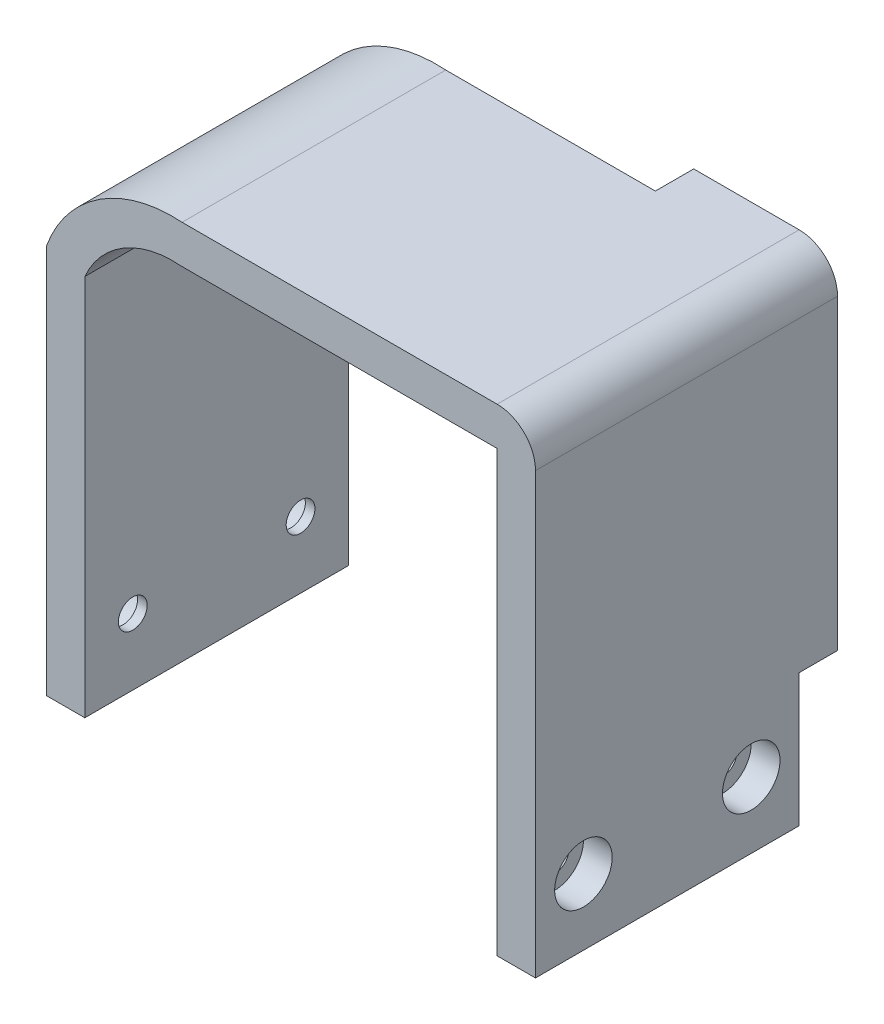
ISO-10303-21;
HEADER;
FILE_DESCRIPTION(('STEP AP214'),'2;1');
FILE_NAME('part.step','',(''),(''),'','','');
FILE_SCHEMA(('AUTOMOTIVE_DESIGN { 1 0 10303 214 1 1 1 1 }'));
ENDSEC;
DATA;
#1=APPLICATION_CONTEXT('core data for automotive mechanical design processes');
#2=APPLICATION_PROTOCOL_DEFINITION('international standard','automotive_design',2000,#1);
#3=PRODUCT_CONTEXT('',#1,'mechanical');
#4=PRODUCT('Part','Part','',(#3));
#5=PRODUCT_RELATED_PRODUCT_CATEGORY('part','',(#4));
#6=PRODUCT_DEFINITION_FORMATION('','',#4);
#7=PRODUCT_DEFINITION_CONTEXT('part definition',#1,'design');
#8=PRODUCT_DEFINITION('design','',#6,#7);
#9=PRODUCT_DEFINITION_SHAPE('','',#8);
#10=(LENGTH_UNIT() NAMED_UNIT(*) SI_UNIT(.MILLI.,.METRE.));
#11=(NAMED_UNIT(*) PLANE_ANGLE_UNIT() SI_UNIT($,.RADIAN.));
#12=(NAMED_UNIT(*) SI_UNIT($,.STERADIAN.) SOLID_ANGLE_UNIT());
#13=UNCERTAINTY_MEASURE_WITH_UNIT(LENGTH_MEASURE(1.E-05),#10,'distance_accuracy_value','');
#14=(GEOMETRIC_REPRESENTATION_CONTEXT(3) GLOBAL_UNCERTAINTY_ASSIGNED_CONTEXT((#13)) GLOBAL_UNIT_ASSIGNED_CONTEXT((#10,
#11,#12)) REPRESENTATION_CONTEXT('',''));
#15=CARTESIAN_POINT('',(0.,0.,0.));
#16=DIRECTION('',(0.,0.,1.));
#17=DIRECTION('',(1.,0.,0.));
#18=AXIS2_PLACEMENT_3D('',#15,#16,#17);
#19=CARTESIAN_POINT('',(-31.2635652675622,-0.826290167174651,27.5));
#20=DIRECTION('',(1.,0.,0.));
#21=DIRECTION('',(0.,0.,-1.));
#22=AXIS2_PLACEMENT_3D('',#19,#20,#21);
#23=PLANE('',#22);
#24=CARTESIAN_POINT('',(-31.2635652675622,6.08685491641266,5.));
#25=DIRECTION('',(1.,0.,0.));
#26=DIRECTION('',(0.,0.,-1.));
#27=AXIS2_PLACEMENT_3D('',#24,#25,#26);
#28=CIRCLE('',#27,3.);
#29=CARTESIAN_POINT('',(-31.2635652675622,6.08685491641266,2.));
#30=VERTEX_POINT('',#29);
#31=EDGE_CURVE('E325',#30,#30,#28,.T.);
#32=ORIENTED_EDGE('',*,*,#31,.T.);
#33=EDGE_LOOP('',(#32));
#34=FACE_BOUND('',#33,.T.);
#35=DIRECTION('',(0.,-1.,0.));
#36=VECTOR('',#35,1.);
#37=CARTESIAN_POINT('',(-31.2635652675622,-0.826290167174651,0.));
#38=LINE('',#37,#36);
#39=CARTESIAN_POINT('',(-31.2635652675622,39.7939229466665,0.));
#40=VERTEX_POINT('',#39);
#41=CARTESIAN_POINT('',(-31.2635652675622,-0.826290167174651,0.));
#42=VERTEX_POINT('',#41);
#43=EDGE_CURVE('E186',#40,#42,#38,.T.);
#44=ORIENTED_EDGE('',*,*,#43,.T.);
#45=DIRECTION('',(0.,0.,-1.));
#46=VECTOR('',#45,1.);
#47=CARTESIAN_POINT('',(-31.2635652675622,-0.826290167174651,27.5));
#48=LINE('',#47,#46);
#49=CARTESIAN_POINT('',(-31.2635652675622,-0.826290167174651,27.5));
#50=VERTEX_POINT('',#49);
#51=EDGE_CURVE('E203',#50,#42,#48,.T.);
#52=ORIENTED_EDGE('',*,*,#51,.F.);
#53=DIRECTION('',(0.,-1.,0.));
#54=VECTOR('',#53,1.);
#55=CARTESIAN_POINT('',(-31.2635652675622,-0.826290167174651,27.5));
#56=LINE('',#55,#54);
#57=CARTESIAN_POINT('',(-31.2635652675622,39.7939229466665,27.5));
#58=VERTEX_POINT('',#57);
#59=EDGE_CURVE('E202',#58,#50,#56,.T.);
#60=ORIENTED_EDGE('',*,*,#59,.F.);
#61=DIRECTION('',(0.,0.,-1.));
#62=VECTOR('',#61,1.);
#63=CARTESIAN_POINT('',(-31.2635652675622,39.7939229466665,27.5));
#64=LINE('',#63,#62);
#65=EDGE_CURVE('E225',#58,#40,#64,.T.);
#66=ORIENTED_EDGE('',*,*,#65,.T.);
#67=EDGE_LOOP('',(#44,#52,#60,#66));
#68=FACE_BOUND('',#67,.T.);
#69=CARTESIAN_POINT('',(-31.2635652675622,6.08685491641266,22.5));
#70=DIRECTION('',(1.,0.,0.));
#71=DIRECTION('',(0.,0.,-1.));
#72=AXIS2_PLACEMENT_3D('',#69,#70,#71);
#73=CIRCLE('',#72,3.);
#74=CARTESIAN_POINT('',(-31.2635652675622,6.08685491641266,19.5));
#75=VERTEX_POINT('',#74);
#76=EDGE_CURVE('E335',#75,#75,#73,.T.);
#77=ORIENTED_EDGE('',*,*,#76,.T.);
#78=EDGE_LOOP('',(#77));
#79=FACE_BOUND('',#78,.T.);
#80=ADVANCED_FACE('F47',(#34,#68,#79),#23,.F.);
#81=CARTESIAN_POINT('',(-31.2635652675622,6.08685491641266,5.));
#82=DIRECTION('',(1.,0.,0.));
#83=DIRECTION('',(0.,0.,-1.));
#84=AXIS2_PLACEMENT_3D('',#81,#82,#83);
#85=CYLINDRICAL_SURFACE('',#84,1.5);
#86=CARTESIAN_POINT('',(-27.2635652675622,6.08685491641266,5.));
#87=DIRECTION('',(-1.,0.,0.));
#88=DIRECTION('',(0.,0.,1.));
#89=AXIS2_PLACEMENT_3D('',#86,#87,#88);
#90=CIRCLE('',#89,1.5);
#91=CARTESIAN_POINT('',(-27.2635652675622,6.08685491641266,6.5));
#92=VERTEX_POINT('',#91);
#93=EDGE_CURVE('E300',#92,#92,#90,.T.);
#94=ORIENTED_EDGE('',*,*,#93,.F.);
#95=EDGE_LOOP('',(#94));
#96=FACE_BOUND('',#95,.T.);
#97=CARTESIAN_POINT('',(-28.2635652675622,6.08685491641266,5.));
#98=DIRECTION('',(1.,0.,0.));
#99=DIRECTION('',(0.,0.,-1.));
#100=AXIS2_PLACEMENT_3D('',#97,#98,#99);
#101=CIRCLE('',#100,1.5);
#102=CARTESIAN_POINT('',(-28.2635652675622,6.08685491641266,3.5));
#103=VERTEX_POINT('',#102);
#104=EDGE_CURVE('E329',#103,#103,#101,.T.);
#105=ORIENTED_EDGE('',*,*,#104,.F.);
#106=EDGE_LOOP('',(#105));
#107=FACE_BOUND('',#106,.T.);
#108=ADVANCED_FACE('F348',(#96,#107),#85,.F.);
#109=CARTESIAN_POINT('',(-31.2635652675622,6.08685491641266,22.5));
#110=DIRECTION('',(1.,0.,0.));
#111=DIRECTION('',(0.,0.,-1.));
#112=AXIS2_PLACEMENT_3D('',#109,#110,#111);
#113=CYLINDRICAL_SURFACE('',#112,1.5);
#114=CARTESIAN_POINT('',(-27.2635652675622,6.08685491641266,22.5));
#115=DIRECTION('',(-1.,0.,0.));
#116=DIRECTION('',(0.,0.,1.));
#117=AXIS2_PLACEMENT_3D('',#114,#115,#116);
#118=CIRCLE('',#117,1.5);
#119=CARTESIAN_POINT('',(-27.2635652675622,6.08685491641266,24.));
#120=VERTEX_POINT('',#119);
#121=EDGE_CURVE('E287',#120,#120,#118,.T.);
#122=ORIENTED_EDGE('',*,*,#121,.F.);
#123=EDGE_LOOP('',(#122));
#124=FACE_BOUND('',#123,.T.);
#125=CARTESIAN_POINT('',(-28.2635652675622,6.08685491641266,22.5));
#126=DIRECTION('',(1.,0.,0.));
#127=DIRECTION('',(0.,0.,-1.));
#128=AXIS2_PLACEMENT_3D('',#125,#126,#127);
#129=CIRCLE('',#128,1.5);
#130=CARTESIAN_POINT('',(-28.2635652675622,6.08685491641266,21.));
#131=VERTEX_POINT('',#130);
#132=EDGE_CURVE('E332',#131,#131,#129,.T.);
#133=ORIENTED_EDGE('',*,*,#132,.F.);
#134=EDGE_LOOP('',(#133));
#135=FACE_BOUND('',#134,.T.);
#136=ADVANCED_FACE('F345',(#124,#135),#113,.F.);
#137=CARTESIAN_POINT('',(15.7364347324378,6.08685491641266,5.));
#138=DIRECTION('',(1.,0.,0.));
#139=DIRECTION('',(0.,1.,0.));
#140=AXIS2_PLACEMENT_3D('',#137,#138,#139);
#141=CIRCLE('',#140,1.5);
#142=CARTESIAN_POINT('',(15.7364347324378,7.58685491641266,5.));
#143=VERTEX_POINT('',#142);
#144=EDGE_CURVE('E303',#143,#143,#141,.T.);
#145=ORIENTED_EDGE('',*,*,#144,.F.);
#146=EDGE_LOOP('',(#145));
#147=FACE_BOUND('',#146,.T.);
#148=CARTESIAN_POINT('',(16.7364347324378,6.08685491641266,5.));
#149=DIRECTION('',(1.,0.,0.));
#150=DIRECTION('',(0.,0.,-1.));
#151=AXIS2_PLACEMENT_3D('',#148,#149,#150);
#152=CIRCLE('',#151,1.5);
#153=CARTESIAN_POINT('',(16.7364347324378,6.08685491641266,3.5));
#154=VERTEX_POINT('',#153);
#155=EDGE_CURVE('E311',#154,#154,#152,.T.);
#156=ORIENTED_EDGE('',*,*,#155,.T.);
#157=EDGE_LOOP('',(#156));
#158=FACE_BOUND('',#157,.T.);
#159=ADVANCED_FACE('F347',(#147,#158),#85,.F.);
#160=CARTESIAN_POINT('',(15.7364347324378,6.08685491641266,22.5));
#161=DIRECTION('',(1.,0.,0.));
#162=DIRECTION('',(0.,1.,0.));
#163=AXIS2_PLACEMENT_3D('',#160,#161,#162);
#164=CIRCLE('',#163,1.5);
#165=CARTESIAN_POINT('',(15.7364347324378,7.58685491641266,22.5));
#166=VERTEX_POINT('',#165);
#167=EDGE_CURVE('E297',#166,#166,#164,.T.);
#168=ORIENTED_EDGE('',*,*,#167,.F.);
#169=EDGE_LOOP('',(#168));
#170=FACE_BOUND('',#169,.T.);
#171=CARTESIAN_POINT('',(16.7364347324378,6.08685491641266,22.5));
#172=DIRECTION('',(1.,0.,0.));
#173=DIRECTION('',(0.,0.,-1.));
#174=AXIS2_PLACEMENT_3D('',#171,#172,#173);
#175=CIRCLE('',#174,1.5);
#176=CARTESIAN_POINT('',(16.7364347324378,6.08685491641266,21.));
#177=VERTEX_POINT('',#176);
#178=EDGE_CURVE('E314',#177,#177,#175,.T.);
#179=ORIENTED_EDGE('',*,*,#178,.T.);
#180=EDGE_LOOP('',(#179));
#181=FACE_BOUND('',#180,.T.);
#182=ADVANCED_FACE('F351',(#170,#181),#113,.F.);
#183=CARTESIAN_POINT('',(12.7364347324378,15.5,-4.));
#184=DIRECTION('',(0.,0.,1.));
#185=DIRECTION('',(1.,0.,0.));
#186=AXIS2_PLACEMENT_3D('',#183,#184,#185);
#187=CYLINDRICAL_SURFACE('',#186,1.25);
#188=CARTESIAN_POINT('',(12.7364347324378,15.5,0.));
#189=DIRECTION('',(0.,0.,1.));
#190=DIRECTION('',(1.,0.,0.));
#191=AXIS2_PLACEMENT_3D('',#188,#189,#190);
#192=CIRCLE('',#191,1.25);
#193=CARTESIAN_POINT('',(13.9864347324378,15.5,0.));
#194=VERTEX_POINT('',#193);
#195=EDGE_CURVE('E271',#194,#194,#192,.T.);
#196=ORIENTED_EDGE('',*,*,#195,.T.);
#197=EDGE_LOOP('',(#196));
#198=FACE_BOUND('',#197,.T.);
#199=CARTESIAN_POINT('',(12.7364347324378,15.5,-2.));
#200=DIRECTION('',(0.,0.,-1.));
#201=DIRECTION('',(-1.,0.,0.));
#202=AXIS2_PLACEMENT_3D('',#199,#200,#201);
#203=CIRCLE('',#202,1.25);
#204=CARTESIAN_POINT('',(11.4864347324378,15.5,-2.));
#205=VERTEX_POINT('',#204);
#206=EDGE_CURVE('E281',#205,#205,#203,.T.);
#207=ORIENTED_EDGE('',*,*,#206,.T.);
#208=EDGE_LOOP('',(#207));
#209=FACE_BOUND('',#208,.T.);
#210=ADVANCED_FACE('F362',(#198,#209),#187,.F.);
#211=CARTESIAN_POINT('',(12.7364347324378,42.5,-4.));
#212=DIRECTION('',(0.,0.,1.));
#213=DIRECTION('',(1.,0.,0.));
#214=AXIS2_PLACEMENT_3D('',#211,#212,#213);
#215=CYLINDRICAL_SURFACE('',#214,1.25);
#216=CARTESIAN_POINT('',(12.7364347324378,42.5,0.));
#217=DIRECTION('',(0.,0.,1.));
#218=DIRECTION('',(1.,0.,0.));
#219=AXIS2_PLACEMENT_3D('',#216,#217,#218);
#220=CIRCLE('',#219,1.25);
#221=CARTESIAN_POINT('',(13.9864347324378,42.5,0.));
#222=VERTEX_POINT('',#221);
#223=EDGE_CURVE('E266',#222,#222,#220,.T.);
#224=ORIENTED_EDGE('',*,*,#223,.T.);
#225=EDGE_LOOP('',(#224));
#226=FACE_BOUND('',#225,.T.);
#227=CARTESIAN_POINT('',(12.7364347324378,42.5,-2.));
#228=DIRECTION('',(0.,0.,-1.));
#229=DIRECTION('',(-1.,0.,0.));
#230=AXIS2_PLACEMENT_3D('',#227,#228,#229);
#231=CIRCLE('',#230,1.25);
#232=CARTESIAN_POINT('',(11.4864347324378,42.5,-2.));
#233=VERTEX_POINT('',#232);
#234=EDGE_CURVE('E284',#233,#233,#231,.T.);
#235=ORIENTED_EDGE('',*,*,#234,.T.);
#236=EDGE_LOOP('',(#235));
#237=FACE_BOUND('',#236,.T.);
#238=ADVANCED_FACE('F411',(#226,#237),#215,.F.);
#239=CARTESIAN_POINT('',(-18.0975943147421,35.0339640319806,0.));
#240=DIRECTION('',(0.,0.,-1.));
#241=DIRECTION('',(-1.,0.,0.));
#242=AXIS2_PLACEMENT_3D('',#239,#240,#241);
#243=PLANE('',#242);
#244=DIRECTION('',(0.,1.,0.));
#245=VECTOR('',#244,1.);
#246=CARTESIAN_POINT('',(4.73643473243776,49.,0.));
#247=LINE('',#246,#245);
#248=CARTESIAN_POINT('',(4.73643473243775,45.,0.));
#249=VERTEX_POINT('',#248);
#250=CARTESIAN_POINT('',(4.73643473243775,49.,0.));
#251=VERTEX_POINT('',#250);
#252=EDGE_CURVE('E248',#249,#251,#247,.T.);
#253=ORIENTED_EDGE('',*,*,#252,.F.);
#254=DIRECTION('',(1.,0.,0.));
#255=VECTOR('',#254,1.);
#256=CARTESIAN_POINT('',(-17.2741095946992,45.,0.));
#257=LINE('',#256,#255);
#258=CARTESIAN_POINT('',(-17.2741095946992,45.,0.));
#259=VERTEX_POINT('',#258);
#260=EDGE_CURVE('E209',#259,#249,#257,.T.);
#261=ORIENTED_EDGE('',*,*,#260,.F.);
#262=CARTESIAN_POINT('',(-18.0975943147421,35.0339640319806,0.));
#263=DIRECTION('',(0.,0.,-1.));
#264=DIRECTION('',(-1.,0.,0.));
#265=AXIS2_PLACEMENT_3D('',#262,#263,#264);
#266=CIRCLE('',#265,10.);
#267=CARTESIAN_POINT('',(-27.2635652675622,39.0320856524492,0.));
#268=VERTEX_POINT('',#267);
#269=EDGE_CURVE('E206',#268,#259,#266,.T.);
#270=ORIENTED_EDGE('',*,*,#269,.F.);
#271=DIRECTION('',(0.,1.,0.));
#272=VECTOR('',#271,1.);
#273=CARTESIAN_POINT('',(-27.2635652675622,-0.826290167174651,0.));
#274=LINE('',#273,#272);
#275=CARTESIAN_POINT('',(-27.2635652675622,-0.826290167174651,0.));
#276=VERTEX_POINT('',#275);
#277=EDGE_CURVE('E176',#276,#268,#274,.T.);
#278=ORIENTED_EDGE('',*,*,#277,.F.);
#279=DIRECTION('',(1.,0.,0.));
#280=VECTOR('',#279,1.);
#281=CARTESIAN_POINT('',(-27.2635652675622,-0.826290167174651,0.));
#282=LINE('',#281,#280);
#283=EDGE_CURVE('E173',#42,#276,#282,.T.);
#284=ORIENTED_EDGE('',*,*,#283,.F.);
#285=ORIENTED_EDGE('',*,*,#43,.F.);
#286=CARTESIAN_POINT('',(-18.0975943147421,35.0339640319806,0.));
#287=DIRECTION('',(0.,0.,1.));
#288=DIRECTION('',(-1.,0.,0.));
#289=AXIS2_PLACEMENT_3D('',#286,#287,#288);
#290=CIRCLE('',#289,14.);
#291=CARTESIAN_POINT('',(-17.1229973005926,49.,0.));
#292=VERTEX_POINT('',#291);
#293=EDGE_CURVE('E220',#292,#40,#290,.T.);
#294=ORIENTED_EDGE('',*,*,#293,.F.);
#295=DIRECTION('',(-1.,0.,0.));
#296=VECTOR('',#295,1.);
#297=CARTESIAN_POINT('',(-17.1229973005926,49.,0.));
#298=LINE('',#297,#296);
#299=EDGE_CURVE('E218',#251,#292,#298,.T.);
#300=ORIENTED_EDGE('',*,*,#299,.F.);
#301=EDGE_LOOP('',(#253,#261,#270,#278,#284,#285,#294,#300));
#302=FACE_BOUND('',#301,.T.);
#303=ADVANCED_FACE('F406',(#302),#243,.T.);
#304=CARTESIAN_POINT('',(-27.2635652675622,-0.826290167174651,27.5));
#305=DIRECTION('',(0.,1.,0.));
#306=DIRECTION('',(0.,0.,1.));
#307=AXIS2_PLACEMENT_3D('',#304,#305,#306);
#308=PLANE('',#307);
#309=ORIENTED_EDGE('',*,*,#283,.T.);
#310=DIRECTION('',(0.,0.,-1.));
#311=VECTOR('',#310,1.);
#312=CARTESIAN_POINT('',(-27.2635652675622,-0.826290167174651,27.5));
#313=LINE('',#312,#311);
#314=CARTESIAN_POINT('',(-27.2635652675622,-0.826290167174651,27.5));
#315=VERTEX_POINT('',#314);
#316=EDGE_CURVE('E245',#315,#276,#313,.T.);
#317=ORIENTED_EDGE('',*,*,#316,.F.);
#318=DIRECTION('',(1.,0.,0.));
#319=VECTOR('',#318,1.);
#320=CARTESIAN_POINT('',(-27.2635652675622,-0.826290167174651,27.5));
#321=LINE('',#320,#319);
#322=EDGE_CURVE('E182',#50,#315,#321,.T.);
#323=ORIENTED_EDGE('',*,*,#322,.F.);
#324=ORIENTED_EDGE('',*,*,#51,.T.);
#325=EDGE_LOOP('',(#309,#317,#323,#324));
#326=FACE_BOUND('',#325,.T.);
#327=ADVANCED_FACE('F403',(#326),#308,.F.);
#328=CARTESIAN_POINT('',(-27.2635652675622,-0.826290167174651,27.5));
#329=DIRECTION('',(-1.,0.,0.));
#330=DIRECTION('',(0.,0.,1.));
#331=AXIS2_PLACEMENT_3D('',#328,#329,#330);
#332=PLANE('',#331);
#333=ORIENTED_EDGE('',*,*,#121,.T.);
#334=EDGE_LOOP('',(#333));
#335=FACE_BOUND('',#334,.T.);
#336=ORIENTED_EDGE('',*,*,#93,.T.);
#337=EDGE_LOOP('',(#336));
#338=FACE_BOUND('',#337,.T.);
#339=ORIENTED_EDGE('',*,*,#277,.T.);
#340=DIRECTION('',(0.,0.,-1.));
#341=VECTOR('',#340,1.);
#342=CARTESIAN_POINT('',(-27.2635652675622,39.0320856524492,27.5));
#343=LINE('',#342,#341);
#344=CARTESIAN_POINT('',(-27.2635652675622,39.0320856524492,27.5));
#345=VERTEX_POINT('',#344);
#346=EDGE_CURVE('E242',#345,#268,#343,.T.);
#347=ORIENTED_EDGE('',*,*,#346,.F.);
#348=DIRECTION('',(0.,1.,0.));
#349=VECTOR('',#348,1.);
#350=CARTESIAN_POINT('',(-27.2635652675622,-0.826290167174651,27.5));
#351=LINE('',#350,#349);
#352=EDGE_CURVE('E185',#315,#345,#351,.T.);
#353=ORIENTED_EDGE('',*,*,#352,.F.);
#354=ORIENTED_EDGE('',*,*,#316,.T.);
#355=EDGE_LOOP('',(#339,#347,#353,#354));
#356=FACE_BOUND('',#355,.T.);
#357=ADVANCED_FACE('F400',(#335,#338,#356),#332,.F.);
#358=CARTESIAN_POINT('',(-18.0975943147421,35.0339640319806,27.5));
#359=DIRECTION('',(0.,0.,-1.));
#360=DIRECTION('',(-1.,0.,0.));
#361=AXIS2_PLACEMENT_3D('',#358,#359,#360);
#362=CYLINDRICAL_SURFACE('',#361,10.);
#363=ORIENTED_EDGE('',*,*,#269,.T.);
#364=DIRECTION('',(0.,0.,-1.));
#365=VECTOR('',#364,1.);
#366=CARTESIAN_POINT('',(-17.2741095946992,45.,27.5));
#367=LINE('',#366,#365);
#368=CARTESIAN_POINT('',(-17.2741095946992,45.,27.5));
#369=VERTEX_POINT('',#368);
#370=EDGE_CURVE('E239',#369,#259,#367,.T.);
#371=ORIENTED_EDGE('',*,*,#370,.F.);
#372=CARTESIAN_POINT('',(-18.0975943147421,35.0339640319806,27.5));
#373=DIRECTION('',(0.,0.,-1.));
#374=DIRECTION('',(-1.,0.,0.));
#375=AXIS2_PLACEMENT_3D('',#372,#373,#374);
#376=CIRCLE('',#375,10.);
#377=EDGE_CURVE('E188',#345,#369,#376,.T.);
#378=ORIENTED_EDGE('',*,*,#377,.F.);
#379=ORIENTED_EDGE('',*,*,#346,.T.);
#380=EDGE_LOOP('',(#363,#371,#378,#379));
#381=FACE_BOUND('',#380,.T.);
#382=ADVANCED_FACE('F396',(#381),#362,.F.);
#383=CARTESIAN_POINT('',(-17.2741095946992,45.,27.5));
#384=DIRECTION('',(0.,1.,0.));
#385=DIRECTION('',(0.,0.,1.));
#386=AXIS2_PLACEMENT_3D('',#383,#384,#385);
#387=PLANE('',#386);
#388=ORIENTED_EDGE('',*,*,#260,.T.);
#389=CARTESIAN_POINT('',(15.7364347324378,45.,0.));
#390=VERTEX_POINT('',#389);
#391=EDGE_CURVE('E208',#249,#390,#257,.T.);
#392=ORIENTED_EDGE('',*,*,#391,.T.);
#393=DIRECTION('',(0.,0.,-1.));
#394=VECTOR('',#393,1.);
#395=CARTESIAN_POINT('',(15.7364347324378,45.,27.5));
#396=LINE('',#395,#394);
#397=CARTESIAN_POINT('',(15.7364347324378,45.,27.5));
#398=VERTEX_POINT('',#397);
#399=EDGE_CURVE('E236',#398,#390,#396,.T.);
#400=ORIENTED_EDGE('',*,*,#399,.F.);
#401=DIRECTION('',(1.,0.,0.));
#402=VECTOR('',#401,1.);
#403=CARTESIAN_POINT('',(-17.2741095946992,45.,27.5));
#404=LINE('',#403,#402);
#405=EDGE_CURVE('E190',#369,#398,#404,.T.);
#406=ORIENTED_EDGE('',*,*,#405,.F.);
#407=ORIENTED_EDGE('',*,*,#370,.T.);
#408=EDGE_LOOP('',(#388,#392,#400,#406,#407));
#409=FACE_BOUND('',#408,.T.);
#410=ADVANCED_FACE('F392',(#409),#387,.F.);
#411=CARTESIAN_POINT('',(15.7364347324378,45.,27.5));
#412=DIRECTION('',(1.,0.,0.));
#413=DIRECTION('',(0.,1.,0.));
#414=AXIS2_PLACEMENT_3D('',#411,#412,#413);
#415=PLANE('',#414);
#416=ORIENTED_EDGE('',*,*,#167,.T.);
#417=EDGE_LOOP('',(#416));
#418=FACE_BOUND('',#417,.T.);
#419=ORIENTED_EDGE('',*,*,#144,.T.);
#420=EDGE_LOOP('',(#419));
#421=FACE_BOUND('',#420,.T.);
#422=DIRECTION('',(0.,-1.,0.));
#423=VECTOR('',#422,1.);
#424=CARTESIAN_POINT('',(15.7364347324378,45.,0.));
#425=LINE('',#424,#423);
#426=CARTESIAN_POINT('',(15.7364347324378,13.,0.));
#427=VERTEX_POINT('',#426);
#428=EDGE_CURVE('E213',#390,#427,#425,.T.);
#429=ORIENTED_EDGE('',*,*,#428,.T.);
#430=CARTESIAN_POINT('',(15.7364347324378,-0.826290167174649,0.));
#431=VERTEX_POINT('',#430);
#432=EDGE_CURVE('E212',#427,#431,#425,.T.);
#433=ORIENTED_EDGE('',*,*,#432,.T.);
#434=DIRECTION('',(0.,0.,-1.));
#435=VECTOR('',#434,1.);
#436=CARTESIAN_POINT('',(15.7364347324378,-0.826290167174649,27.5));
#437=LINE('',#436,#435);
#438=CARTESIAN_POINT('',(15.7364347324378,-0.826290167174649,27.5));
#439=VERTEX_POINT('',#438);
#440=EDGE_CURVE('E233',#439,#431,#437,.T.);
#441=ORIENTED_EDGE('',*,*,#440,.F.);
#442=DIRECTION('',(0.,-1.,0.));
#443=VECTOR('',#442,1.);
#444=CARTESIAN_POINT('',(15.7364347324378,45.,27.5));
#445=LINE('',#444,#443);
#446=EDGE_CURVE('E192',#398,#439,#445,.T.);
#447=ORIENTED_EDGE('',*,*,#446,.F.);
#448=ORIENTED_EDGE('',*,*,#399,.T.);
#449=EDGE_LOOP('',(#429,#433,#441,#447,#448));
#450=FACE_BOUND('',#449,.T.);
#451=ADVANCED_FACE('F388',(#418,#421,#450),#415,.F.);
#452=CARTESIAN_POINT('',(15.7364347324378,-0.826290167174649,27.5));
#453=DIRECTION('',(0.,1.,0.));
#454=DIRECTION('',(-1.,0.,0.));
#455=AXIS2_PLACEMENT_3D('',#452,#453,#454);
#456=PLANE('',#455);
#457=DIRECTION('',(1.,0.,0.));
#458=VECTOR('',#457,1.);
#459=CARTESIAN_POINT('',(15.7364347324378,-0.826290167174649,0.));
#460=LINE('',#459,#458);
#461=CARTESIAN_POINT('',(19.7364347324378,-0.826290167174649,0.));
#462=VERTEX_POINT('',#461);
#463=EDGE_CURVE('E215',#431,#462,#460,.T.);
#464=ORIENTED_EDGE('',*,*,#463,.T.);
#465=DIRECTION('',(0.,0.,-1.));
#466=VECTOR('',#465,1.);
#467=CARTESIAN_POINT('',(19.7364347324378,-0.826290167174649,27.5));
#468=LINE('',#467,#466);
#469=CARTESIAN_POINT('',(19.7364347324378,-0.826290167174649,27.5));
#470=VERTEX_POINT('',#469);
#471=EDGE_CURVE('E231',#470,#462,#468,.T.);
#472=ORIENTED_EDGE('',*,*,#471,.F.);
#473=DIRECTION('',(1.,0.,0.));
#474=VECTOR('',#473,1.);
#475=CARTESIAN_POINT('',(15.7364347324378,-0.826290167174649,27.5));
#476=LINE('',#475,#474);
#477=EDGE_CURVE('E194',#439,#470,#476,.T.);
#478=ORIENTED_EDGE('',*,*,#477,.F.);
#479=ORIENTED_EDGE('',*,*,#440,.T.);
#480=EDGE_LOOP('',(#464,#472,#478,#479));
#481=FACE_BOUND('',#480,.T.);
#482=ADVANCED_FACE('F384',(#481),#456,.F.);
#483=CARTESIAN_POINT('',(19.7364347324378,49.,27.5));
#484=DIRECTION('',(-1.,0.,0.));
#485=DIRECTION('',(0.,-1.,0.));
#486=AXIS2_PLACEMENT_3D('',#483,#484,#485);
#487=PLANE('',#486);
#488=CARTESIAN_POINT('',(19.7364347324378,6.08685491641266,22.5));
#489=DIRECTION('',(1.,0.,0.));
#490=DIRECTION('',(0.,0.,-1.));
#491=AXIS2_PLACEMENT_3D('',#488,#489,#490);
#492=CIRCLE('',#491,3.);
#493=CARTESIAN_POINT('',(19.7364347324378,6.08685491641266,19.5));
#494=VERTEX_POINT('',#493);
#495=EDGE_CURVE('E318',#494,#494,#492,.T.);
#496=ORIENTED_EDGE('',*,*,#495,.F.);
#497=EDGE_LOOP('',(#496));
#498=FACE_BOUND('',#497,.T.);
#499=CARTESIAN_POINT('',(19.7364347324378,6.08685491641266,5.));
#500=DIRECTION('',(1.,0.,0.));
#501=DIRECTION('',(0.,0.,-1.));
#502=AXIS2_PLACEMENT_3D('',#499,#500,#501);
#503=CIRCLE('',#502,3.);
#504=CARTESIAN_POINT('',(19.7364347324378,6.08685491641266,2.));
#505=VERTEX_POINT('',#504);
#506=EDGE_CURVE('E307',#505,#505,#503,.T.);
#507=ORIENTED_EDGE('',*,*,#506,.F.);
#508=EDGE_LOOP('',(#507));
#509=FACE_BOUND('',#508,.T.);
#510=DIRECTION('',(0.,-1.,0.));
#511=VECTOR('',#510,1.);
#512=CARTESIAN_POINT('',(19.7364347324378,49.,-4.));
#513=LINE('',#512,#511);
#514=CARTESIAN_POINT('',(19.7364347324378,45.,-4.));
#515=VERTEX_POINT('',#514);
#516=CARTESIAN_POINT('',(19.7364347324378,13.,-4.));
#517=VERTEX_POINT('',#516);
#518=EDGE_CURVE('E150',#515,#517,#513,.T.);
#519=ORIENTED_EDGE('',*,*,#518,.F.);
#520=DIRECTION('',(0.,0.,-1.));
#521=VECTOR('',#520,1.);
#522=CARTESIAN_POINT('',(19.7364347324378,45.,27.5));
#523=LINE('',#522,#521);
#524=CARTESIAN_POINT('',(19.7364347324378,45.,27.5));
#525=VERTEX_POINT('',#524);
#526=EDGE_CURVE('E55',#515,#525,#523,.F.);
#527=ORIENTED_EDGE('',*,*,#526,.T.);
#528=DIRECTION('',(0.,1.,0.));
#529=VECTOR('',#528,1.);
#530=CARTESIAN_POINT('',(19.7364347324378,49.,27.5));
#531=LINE('',#530,#529);
#532=EDGE_CURVE('E196',#470,#525,#531,.T.);
#533=ORIENTED_EDGE('',*,*,#532,.F.);
#534=ORIENTED_EDGE('',*,*,#471,.T.);
#535=DIRECTION('',(0.,1.,0.));
#536=VECTOR('',#535,1.);
#537=CARTESIAN_POINT('',(19.7364347324378,49.,0.));
#538=LINE('',#537,#536);
#539=CARTESIAN_POINT('',(19.7364347324378,13.,0.));
#540=VERTEX_POINT('',#539);
#541=EDGE_CURVE('E172',#462,#540,#538,.T.);
#542=ORIENTED_EDGE('',*,*,#541,.T.);
#543=DIRECTION('',(0.,0.,1.));
#544=VECTOR('',#543,1.);
#545=CARTESIAN_POINT('',(19.7364347324378,13.,-4.));
#546=LINE('',#545,#544);
#547=EDGE_CURVE('E162',#517,#540,#546,.T.);
#548=ORIENTED_EDGE('',*,*,#547,.F.);
#549=EDGE_LOOP('',(#519,#527,#533,#534,#542,#548));
#550=FACE_BOUND('',#549,.T.);
#551=ADVANCED_FACE('F169',(#498,#509,#550),#487,.F.);
#552=CARTESIAN_POINT('',(-17.1229973005926,49.,27.5));
#553=DIRECTION('',(0.,-1.,0.));
#554=DIRECTION('',(0.,0.,-1.));
#555=AXIS2_PLACEMENT_3D('',#552,#553,#554);
#556=PLANE('',#555);
#557=DIRECTION('',(-1.,0.,0.));
#558=VECTOR('',#557,1.);
#559=CARTESIAN_POINT('',(-17.1229973005926,49.,27.5));
#560=LINE('',#559,#558);
#561=CARTESIAN_POINT('',(15.7364347324378,49.,27.5));
#562=VERTEX_POINT('',#561);
#563=CARTESIAN_POINT('',(-17.1229973005926,49.,27.5));
#564=VERTEX_POINT('',#563);
#565=EDGE_CURVE('E198',#562,#564,#560,.T.);
#566=ORIENTED_EDGE('',*,*,#565,.F.);
#567=DIRECTION('',(0.,0.,-1.));
#568=VECTOR('',#567,1.);
#569=CARTESIAN_POINT('',(15.7364347324378,49.,27.5));
#570=LINE('',#569,#568);
#571=CARTESIAN_POINT('',(15.7364347324378,49.,-4.));
#572=VERTEX_POINT('',#571);
#573=EDGE_CURVE('E249',#562,#572,#570,.T.);
#574=ORIENTED_EDGE('',*,*,#573,.T.);
#575=DIRECTION('',(1.,0.,0.));
#576=VECTOR('',#575,1.);
#577=CARTESIAN_POINT('',(19.7364347324378,49.,-4.));
#578=LINE('',#577,#576);
#579=CARTESIAN_POINT('',(4.73643473243776,49.,-4.));
#580=VERTEX_POINT('',#579);
#581=EDGE_CURVE('E268',#580,#572,#578,.T.);
#582=ORIENTED_EDGE('',*,*,#581,.F.);
#583=DIRECTION('',(0.,0.,1.));
#584=VECTOR('',#583,1.);
#585=CARTESIAN_POINT('',(4.73643473243776,49.,-4.));
#586=LINE('',#585,#584);
#587=EDGE_CURVE('E178',#580,#251,#586,.T.);
#588=ORIENTED_EDGE('',*,*,#587,.T.);
#589=ORIENTED_EDGE('',*,*,#299,.T.);
#590=DIRECTION('',(0.,0.,-1.));
#591=VECTOR('',#590,1.);
#592=CARTESIAN_POINT('',(-17.1229973005926,49.,27.5));
#593=LINE('',#592,#591);
#594=EDGE_CURVE('E228',#564,#292,#593,.T.);
#595=ORIENTED_EDGE('',*,*,#594,.F.);
#596=EDGE_LOOP('',(#566,#574,#582,#588,#589,#595));
#597=FACE_BOUND('',#596,.T.);
#598=ADVANCED_FACE('F378',(#597),#556,.F.);
#599=CARTESIAN_POINT('',(-18.0975943147421,35.0339640319806,27.5));
#600=DIRECTION('',(0.,0.,-1.));
#601=DIRECTION('',(-1.,0.,0.));
#602=AXIS2_PLACEMENT_3D('',#599,#600,#601);
#603=CYLINDRICAL_SURFACE('',#602,14.);
#604=ORIENTED_EDGE('',*,*,#293,.T.);
#605=ORIENTED_EDGE('',*,*,#65,.F.);
#606=CARTESIAN_POINT('',(-18.0975943147421,35.0339640319806,27.5));
#607=DIRECTION('',(0.,0.,1.));
#608=DIRECTION('',(-1.,0.,0.));
#609=AXIS2_PLACEMENT_3D('',#606,#607,#608);
#610=CIRCLE('',#609,14.);
#611=EDGE_CURVE('E200',#564,#58,#610,.T.);
#612=ORIENTED_EDGE('',*,*,#611,.F.);
#613=ORIENTED_EDGE('',*,*,#594,.T.);
#614=EDGE_LOOP('',(#604,#605,#612,#613));
#615=FACE_BOUND('',#614,.T.);
#616=ADVANCED_FACE('F374',(#615),#603,.T.);
#617=CARTESIAN_POINT('',(-18.0975943147421,35.0339640319806,27.5));
#618=DIRECTION('',(0.,0.,-1.));
#619=DIRECTION('',(-1.,0.,0.));
#620=AXIS2_PLACEMENT_3D('',#617,#618,#619);
#621=PLANE('',#620);
#622=ORIENTED_EDGE('',*,*,#532,.T.);
#623=CARTESIAN_POINT('',(15.7364347324378,45.,27.5));
#624=DIRECTION('',(0.,0.,-1.));
#625=DIRECTION('',(-1.,0.,0.));
#626=AXIS2_PLACEMENT_3D('',#623,#624,#625);
#627=CIRCLE('',#626,4.);
#628=EDGE_CURVE('E13',#525,#562,#627,.F.);
#629=ORIENTED_EDGE('',*,*,#628,.T.);
#630=ORIENTED_EDGE('',*,*,#565,.T.);
#631=ORIENTED_EDGE('',*,*,#611,.T.);
#632=ORIENTED_EDGE('',*,*,#59,.T.);
#633=ORIENTED_EDGE('',*,*,#322,.T.);
#634=ORIENTED_EDGE('',*,*,#352,.T.);
#635=ORIENTED_EDGE('',*,*,#377,.T.);
#636=ORIENTED_EDGE('',*,*,#405,.T.);
#637=ORIENTED_EDGE('',*,*,#446,.T.);
#638=ORIENTED_EDGE('',*,*,#477,.T.);
#639=EDGE_LOOP('',(#622,#629,#630,#631,#632,#633,#634,#635,#636,#637,#638));
#640=FACE_BOUND('',#639,.T.);
#641=ADVANCED_FACE('F377',(#640),#621,.F.);
#642=DIRECTION('',(-1.,0.,0.));
#643=VECTOR('',#642,1.);
#644=CARTESIAN_POINT('',(19.7364347324378,13.,0.));
#645=LINE('',#644,#643);
#646=EDGE_CURVE('E263',#540,#427,#645,.T.);
#647=ORIENTED_EDGE('',*,*,#646,.F.);
#648=ORIENTED_EDGE('',*,*,#541,.F.);
#649=ORIENTED_EDGE('',*,*,#463,.F.);
#650=ORIENTED_EDGE('',*,*,#432,.F.);
#651=EDGE_LOOP('',(#647,#648,#649,#650));
#652=FACE_BOUND('',#651,.T.);
#653=ADVANCED_FACE('F372',(#652),#243,.T.);
#654=CARTESIAN_POINT('',(19.7364347324378,13.,-4.));
#655=DIRECTION('',(0.,1.,0.));
#656=DIRECTION('',(0.,0.,1.));
#657=AXIS2_PLACEMENT_3D('',#654,#655,#656);
#658=PLANE('',#657);
#659=ORIENTED_EDGE('',*,*,#646,.T.);
#660=CARTESIAN_POINT('',(4.73643473243775,13.,0.));
#661=VERTEX_POINT('',#660);
#662=EDGE_CURVE('E265',#427,#661,#645,.T.);
#663=ORIENTED_EDGE('',*,*,#662,.T.);
#664=DIRECTION('',(0.,0.,1.));
#665=VECTOR('',#664,1.);
#666=CARTESIAN_POINT('',(4.73643473243775,13.,-4.));
#667=LINE('',#666,#665);
#668=CARTESIAN_POINT('',(4.73643473243775,13.,-4.));
#669=VERTEX_POINT('',#668);
#670=EDGE_CURVE('E164',#669,#661,#667,.T.);
#671=ORIENTED_EDGE('',*,*,#670,.F.);
#672=DIRECTION('',(-1.,0.,0.));
#673=VECTOR('',#672,1.);
#674=CARTESIAN_POINT('',(19.7364347324378,13.,-4.));
#675=LINE('',#674,#673);
#676=EDGE_CURVE('E153',#517,#669,#675,.T.);
#677=ORIENTED_EDGE('',*,*,#676,.F.);
#678=ORIENTED_EDGE('',*,*,#547,.T.);
#679=EDGE_LOOP('',(#659,#663,#671,#677,#678));
#680=FACE_BOUND('',#679,.T.);
#681=ADVANCED_FACE('F161',(#680),#658,.F.);
#682=CARTESIAN_POINT('',(4.73643473243776,49.,-4.));
#683=DIRECTION('',(1.,0.,0.));
#684=DIRECTION('',(0.,1.,0.));
#685=AXIS2_PLACEMENT_3D('',#682,#683,#684);
#686=PLANE('',#685);
#687=EDGE_CURVE('E156',#661,#249,#247,.T.);
#688=ORIENTED_EDGE('',*,*,#687,.T.);
#689=ORIENTED_EDGE('',*,*,#252,.T.);
#690=ORIENTED_EDGE('',*,*,#587,.F.);
#691=DIRECTION('',(0.,1.,0.));
#692=VECTOR('',#691,1.);
#693=CARTESIAN_POINT('',(4.73643473243776,49.,-4.));
#694=LINE('',#693,#692);
#695=EDGE_CURVE('E166',#669,#580,#694,.T.);
#696=ORIENTED_EDGE('',*,*,#695,.F.);
#697=ORIENTED_EDGE('',*,*,#670,.T.);
#698=EDGE_LOOP('',(#688,#689,#690,#696,#697));
#699=FACE_BOUND('',#698,.T.);
#700=ADVANCED_FACE('F430',(#699),#686,.F.);
#701=CARTESIAN_POINT('',(0.,0.,-4.));
#702=DIRECTION('',(0.,0.,-1.));
#703=DIRECTION('',(-1.,0.,0.));
#704=AXIS2_PLACEMENT_3D('',#701,#702,#703);
#705=PLANE('',#704);
#706=CARTESIAN_POINT('',(12.7364347324378,42.5,-4.));
#707=DIRECTION('',(0.,0.,-1.));
#708=DIRECTION('',(-1.,0.,0.));
#709=AXIS2_PLACEMENT_3D('',#706,#707,#708);
#710=CIRCLE('',#709,2.00000000000001);
#711=CARTESIAN_POINT('',(10.7364347324378,42.5,-4.));
#712=VERTEX_POINT('',#711);
#713=EDGE_CURVE('E288',#712,#712,#710,.T.);
#714=ORIENTED_EDGE('',*,*,#713,.F.);
#715=EDGE_LOOP('',(#714));
#716=FACE_BOUND('',#715,.T.);
#717=CARTESIAN_POINT('',(12.7364347324378,15.5,-4.));
#718=DIRECTION('',(0.,0.,-1.));
#719=DIRECTION('',(-1.,0.,0.));
#720=AXIS2_PLACEMENT_3D('',#717,#718,#719);
#721=CIRCLE('',#720,2.00000000000001);
#722=CARTESIAN_POINT('',(10.7364347324378,15.5,-4.));
#723=VERTEX_POINT('',#722);
#724=EDGE_CURVE('E277',#723,#723,#721,.T.);
#725=ORIENTED_EDGE('',*,*,#724,.F.);
#726=EDGE_LOOP('',(#725));
#727=FACE_BOUND('',#726,.T.);
#728=ORIENTED_EDGE('',*,*,#581,.T.);
#729=CARTESIAN_POINT('',(15.7364347324378,45.,-4.));
#730=DIRECTION('',(0.,0.,-1.));
#731=DIRECTION('',(-1.,0.,0.));
#732=AXIS2_PLACEMENT_3D('',#729,#730,#731);
#733=CIRCLE('',#732,4.);
#734=EDGE_CURVE('E69',#572,#515,#733,.T.);
#735=ORIENTED_EDGE('',*,*,#734,.T.);
#736=ORIENTED_EDGE('',*,*,#518,.T.);
#737=ORIENTED_EDGE('',*,*,#676,.T.);
#738=ORIENTED_EDGE('',*,*,#695,.T.);
#739=EDGE_LOOP('',(#728,#735,#736,#737,#738));
#740=FACE_BOUND('',#739,.T.);
#741=ADVANCED_FACE('F152',(#716,#727,#740),#705,.T.);
#742=CARTESIAN_POINT('',(0.,0.,0.));
#743=DIRECTION('',(0.,0.,-1.));
#744=DIRECTION('',(-1.,0.,0.));
#745=AXIS2_PLACEMENT_3D('',#742,#743,#744);
#746=PLANE('',#745);
#747=ORIENTED_EDGE('',*,*,#223,.F.);
#748=EDGE_LOOP('',(#747));
#749=FACE_BOUND('',#748,.T.);
#750=ORIENTED_EDGE('',*,*,#195,.F.);
#751=EDGE_LOOP('',(#750));
#752=FACE_BOUND('',#751,.T.);
#753=ORIENTED_EDGE('',*,*,#428,.F.);
#754=ORIENTED_EDGE('',*,*,#391,.F.);
#755=ORIENTED_EDGE('',*,*,#687,.F.);
#756=ORIENTED_EDGE('',*,*,#662,.F.);
#757=EDGE_LOOP('',(#753,#754,#755,#756));
#758=FACE_BOUND('',#757,.T.);
#759=ADVANCED_FACE('F435',(#749,#752,#758),#746,.F.);
#760=CARTESIAN_POINT('',(12.7364347324378,42.5,-2.));
#761=DIRECTION('',(0.,0.,-1.));
#762=DIRECTION('',(-1.,0.,0.));
#763=AXIS2_PLACEMENT_3D('',#760,#761,#762);
#764=CYLINDRICAL_SURFACE('',#763,2.00000000000001);
#765=CARTESIAN_POINT('',(12.7364347324378,42.5,-2.));
#766=DIRECTION('',(0.,0.,-1.));
#767=DIRECTION('',(-1.,0.,0.));
#768=AXIS2_PLACEMENT_3D('',#765,#766,#767);
#769=CIRCLE('',#768,2.00000000000001);
#770=CARTESIAN_POINT('',(10.7364347324378,42.5,-2.));
#771=VERTEX_POINT('',#770);
#772=EDGE_CURVE('E274',#771,#771,#769,.T.);
#773=ORIENTED_EDGE('',*,*,#772,.F.);
#774=EDGE_LOOP('',(#773));
#775=FACE_BOUND('',#774,.T.);
#776=ORIENTED_EDGE('',*,*,#713,.T.);
#777=EDGE_LOOP('',(#776));
#778=FACE_BOUND('',#777,.T.);
#779=ADVANCED_FACE('F461',(#775,#778),#764,.F.);
#780=CARTESIAN_POINT('',(12.7364347324378,42.5,-2.));
#781=DIRECTION('',(0.,0.,-1.));
#782=DIRECTION('',(-1.,0.,0.));
#783=AXIS2_PLACEMENT_3D('',#780,#781,#782);
#784=PLANE('',#783);
#785=ORIENTED_EDGE('',*,*,#234,.F.);
#786=EDGE_LOOP('',(#785));
#787=FACE_BOUND('',#786,.T.);
#788=ORIENTED_EDGE('',*,*,#772,.T.);
#789=EDGE_LOOP('',(#788));
#790=FACE_BOUND('',#789,.T.);
#791=ADVANCED_FACE('F476',(#787,#790),#784,.T.);
#792=CARTESIAN_POINT('',(12.7364347324378,15.5,-2.));
#793=DIRECTION('',(0.,0.,-1.));
#794=DIRECTION('',(-1.,0.,0.));
#795=AXIS2_PLACEMENT_3D('',#792,#793,#794);
#796=CYLINDRICAL_SURFACE('',#795,2.00000000000001);
#797=CARTESIAN_POINT('',(12.7364347324378,15.5,-2.));
#798=DIRECTION('',(0.,0.,-1.));
#799=DIRECTION('',(-1.,0.,0.));
#800=AXIS2_PLACEMENT_3D('',#797,#798,#799);
#801=CIRCLE('',#800,2.00000000000001);
#802=CARTESIAN_POINT('',(10.7364347324378,15.5,-2.));
#803=VERTEX_POINT('',#802);
#804=EDGE_CURVE('E280',#803,#803,#801,.T.);
#805=ORIENTED_EDGE('',*,*,#804,.F.);
#806=EDGE_LOOP('',(#805));
#807=FACE_BOUND('',#806,.T.);
#808=ORIENTED_EDGE('',*,*,#724,.T.);
#809=EDGE_LOOP('',(#808));
#810=FACE_BOUND('',#809,.T.);
#811=ADVANCED_FACE('F472',(#807,#810),#796,.F.);
#812=CARTESIAN_POINT('',(12.7364347324378,15.5,-2.));
#813=DIRECTION('',(0.,0.,-1.));
#814=DIRECTION('',(-1.,0.,0.));
#815=AXIS2_PLACEMENT_3D('',#812,#813,#814);
#816=PLANE('',#815);
#817=ORIENTED_EDGE('',*,*,#206,.F.);
#818=EDGE_LOOP('',(#817));
#819=FACE_BOUND('',#818,.T.);
#820=ORIENTED_EDGE('',*,*,#804,.T.);
#821=EDGE_LOOP('',(#820));
#822=FACE_BOUND('',#821,.T.);
#823=ADVANCED_FACE('F475',(#819,#822),#816,.T.);
#824=CARTESIAN_POINT('',(16.7364347324378,6.08685491641266,22.5));
#825=DIRECTION('',(1.,0.,0.));
#826=DIRECTION('',(0.,0.,-1.));
#827=AXIS2_PLACEMENT_3D('',#824,#825,#826);
#828=CYLINDRICAL_SURFACE('',#827,3.);
#829=CARTESIAN_POINT('',(16.7364347324378,6.08685491641266,22.5));
#830=DIRECTION('',(1.,0.,0.));
#831=DIRECTION('',(0.,0.,-1.));
#832=AXIS2_PLACEMENT_3D('',#829,#830,#831);
#833=CIRCLE('',#832,3.);
#834=CARTESIAN_POINT('',(16.7364347324378,6.08685491641266,19.5));
#835=VERTEX_POINT('',#834);
#836=EDGE_CURVE('E306',#835,#835,#833,.T.);
#837=ORIENTED_EDGE('',*,*,#836,.F.);
#838=EDGE_LOOP('',(#837));
#839=FACE_BOUND('',#838,.T.);
#840=ORIENTED_EDGE('',*,*,#495,.T.);
#841=EDGE_LOOP('',(#840));
#842=FACE_BOUND('',#841,.T.);
#843=ADVANCED_FACE('F480',(#839,#842),#828,.F.);
#844=CARTESIAN_POINT('',(16.7364347324378,6.08685491641266,22.5));
#845=DIRECTION('',(1.,0.,0.));
#846=DIRECTION('',(0.,0.,-1.));
#847=AXIS2_PLACEMENT_3D('',#844,#845,#846);
#848=PLANE('',#847);
#849=ORIENTED_EDGE('',*,*,#178,.F.);
#850=EDGE_LOOP('',(#849));
#851=FACE_BOUND('',#850,.T.);
#852=ORIENTED_EDGE('',*,*,#836,.T.);
#853=EDGE_LOOP('',(#852));
#854=FACE_BOUND('',#853,.T.);
#855=ADVANCED_FACE('F515',(#851,#854),#848,.T.);
#856=CARTESIAN_POINT('',(16.7364347324378,6.08685491641266,5.));
#857=DIRECTION('',(1.,0.,0.));
#858=DIRECTION('',(0.,0.,-1.));
#859=AXIS2_PLACEMENT_3D('',#856,#857,#858);
#860=CYLINDRICAL_SURFACE('',#859,3.);
#861=CARTESIAN_POINT('',(16.7364347324378,6.08685491641266,5.));
#862=DIRECTION('',(1.,0.,0.));
#863=DIRECTION('',(0.,0.,-1.));
#864=AXIS2_PLACEMENT_3D('',#861,#862,#863);
#865=CIRCLE('',#864,3.);
#866=CARTESIAN_POINT('',(16.7364347324378,6.08685491641266,2.));
#867=VERTEX_POINT('',#866);
#868=EDGE_CURVE('E310',#867,#867,#865,.T.);
#869=ORIENTED_EDGE('',*,*,#868,.F.);
#870=EDGE_LOOP('',(#869));
#871=FACE_BOUND('',#870,.T.);
#872=ORIENTED_EDGE('',*,*,#506,.T.);
#873=EDGE_LOOP('',(#872));
#874=FACE_BOUND('',#873,.T.);
#875=ADVANCED_FACE('F524',(#871,#874),#860,.F.);
#876=CARTESIAN_POINT('',(16.7364347324378,6.08685491641266,5.));
#877=DIRECTION('',(1.,0.,0.));
#878=DIRECTION('',(0.,0.,-1.));
#879=AXIS2_PLACEMENT_3D('',#876,#877,#878);
#880=PLANE('',#879);
#881=ORIENTED_EDGE('',*,*,#155,.F.);
#882=EDGE_LOOP('',(#881));
#883=FACE_BOUND('',#882,.T.);
#884=ORIENTED_EDGE('',*,*,#868,.T.);
#885=EDGE_LOOP('',(#884));
#886=FACE_BOUND('',#885,.T.);
#887=ADVANCED_FACE('F532',(#883,#886),#880,.T.);
#888=CARTESIAN_POINT('',(-28.2635652675622,6.08685491641266,22.5));
#889=DIRECTION('',(-1.,0.,0.));
#890=DIRECTION('',(0.,0.,-1.));
#891=AXIS2_PLACEMENT_3D('',#888,#889,#890);
#892=PLANE('',#891);
#893=CARTESIAN_POINT('',(-28.2635652675622,6.08685491641266,22.5));
#894=DIRECTION('',(1.,0.,0.));
#895=DIRECTION('',(0.,0.,-1.));
#896=AXIS2_PLACEMENT_3D('',#893,#894,#895);
#897=CIRCLE('',#896,3.);
#898=CARTESIAN_POINT('',(-28.2635652675622,6.08685491641266,19.5));
#899=VERTEX_POINT('',#898);
#900=EDGE_CURVE('E317',#899,#899,#897,.T.);
#901=ORIENTED_EDGE('',*,*,#900,.F.);
#902=EDGE_LOOP('',(#901));
#903=FACE_BOUND('',#902,.T.);
#904=ORIENTED_EDGE('',*,*,#132,.T.);
#905=EDGE_LOOP('',(#904));
#906=FACE_BOUND('',#905,.T.);
#907=ADVANCED_FACE('F343',(#903,#906),#892,.T.);
#908=CARTESIAN_POINT('',(-28.2635652675622,6.08685491641266,22.5));
#909=DIRECTION('',(-1.,0.,0.));
#910=DIRECTION('',(0.,0.,1.));
#911=AXIS2_PLACEMENT_3D('',#908,#909,#910);
#912=CYLINDRICAL_SURFACE('',#911,3.);
#913=ORIENTED_EDGE('',*,*,#900,.T.);
#914=EDGE_LOOP('',(#913));
#915=FACE_BOUND('',#914,.T.);
#916=ORIENTED_EDGE('',*,*,#76,.F.);
#917=EDGE_LOOP('',(#916));
#918=FACE_BOUND('',#917,.T.);
#919=ADVANCED_FACE('F546',(#915,#918),#912,.F.);
#920=CARTESIAN_POINT('',(-28.2635652675622,6.08685491641266,5.));
#921=DIRECTION('',(-1.,0.,0.));
#922=DIRECTION('',(0.,0.,-1.));
#923=AXIS2_PLACEMENT_3D('',#920,#921,#922);
#924=PLANE('',#923);
#925=CARTESIAN_POINT('',(-28.2635652675622,6.08685491641266,5.));
#926=DIRECTION('',(1.,0.,0.));
#927=DIRECTION('',(0.,0.,-1.));
#928=AXIS2_PLACEMENT_3D('',#925,#926,#927);
#929=CIRCLE('',#928,3.);
#930=CARTESIAN_POINT('',(-28.2635652675622,6.08685491641266,2.));
#931=VERTEX_POINT('',#930);
#932=EDGE_CURVE('E328',#931,#931,#929,.T.);
#933=ORIENTED_EDGE('',*,*,#932,.F.);
#934=EDGE_LOOP('',(#933));
#935=FACE_BOUND('',#934,.T.);
#936=ORIENTED_EDGE('',*,*,#104,.T.);
#937=EDGE_LOOP('',(#936));
#938=FACE_BOUND('',#937,.T.);
#939=ADVANCED_FACE('F554',(#935,#938),#924,.T.);
#940=CARTESIAN_POINT('',(-28.2635652675622,6.08685491641266,5.));
#941=DIRECTION('',(-1.,0.,0.));
#942=DIRECTION('',(0.,0.,1.));
#943=AXIS2_PLACEMENT_3D('',#940,#941,#942);
#944=CYLINDRICAL_SURFACE('',#943,3.);
#945=ORIENTED_EDGE('',*,*,#932,.T.);
#946=EDGE_LOOP('',(#945));
#947=FACE_BOUND('',#946,.T.);
#948=ORIENTED_EDGE('',*,*,#31,.F.);
#949=EDGE_LOOP('',(#948));
#950=FACE_BOUND('',#949,.T.);
#951=ADVANCED_FACE('F562',(#947,#950),#944,.F.);
#952=CARTESIAN_POINT('',(15.7364347324378,45.,27.5));
#953=DIRECTION('',(0.,0.,-1.));
#954=DIRECTION('',(-1.,0.,0.));
#955=AXIS2_PLACEMENT_3D('',#952,#953,#954);
#956=CYLINDRICAL_SURFACE('',#955,4.);
#957=ORIENTED_EDGE('',*,*,#628,.F.);
#958=ORIENTED_EDGE('',*,*,#526,.F.);
#959=ORIENTED_EDGE('',*,*,#734,.F.);
#960=ORIENTED_EDGE('',*,*,#573,.F.);
#961=EDGE_LOOP('',(#957,#958,#959,#960));
#962=FACE_BOUND('',#961,.T.);
#963=ADVANCED_FACE('F49',(#962),#956,.T.);
#964=CLOSED_SHELL('',(#80,#108,#136,#159,#182,#210,#238,#303,#327,#357,#382,#410,#451,#482,#551,
#598,#616,#641,#653,#681,#700,#741,#759,#779,#791,#811,#823,#843,#855,#875,#887,#907,#919,#939,
#951,#963));
#965=MANIFOLD_SOLID_BREP('B2',#964);
#966=ADVANCED_BREP_SHAPE_REPRESENTATION('',(#18,#965),#14);
#967=SHAPE_DEFINITION_REPRESENTATION(#9,#966);
ENDSEC;
END-ISO-10303-21;
